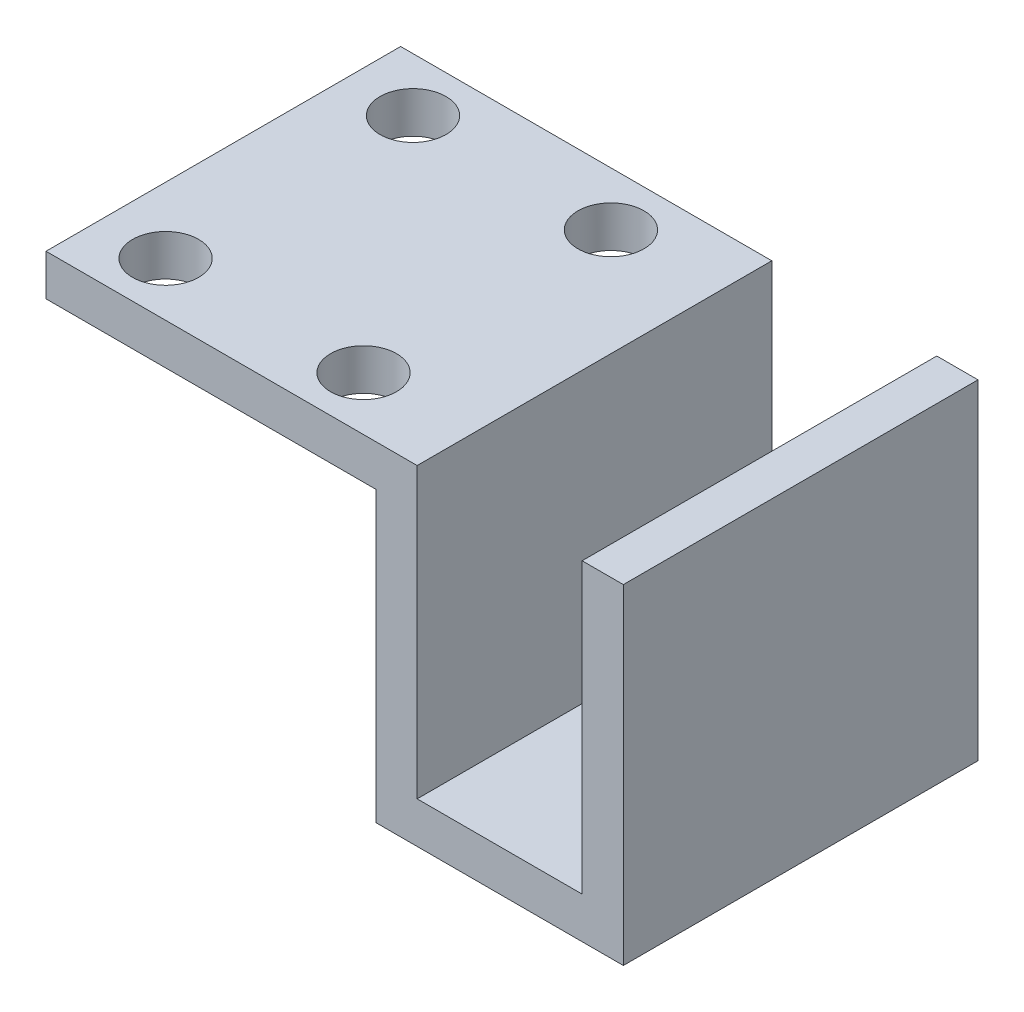
ISO-10303-21;
HEADER;
FILE_DESCRIPTION(('STEP AP214'),'2;1');
FILE_NAME('part.step','',(''),(''),'','','');
FILE_SCHEMA(('AUTOMOTIVE_DESIGN { 1 0 10303 214 1 1 1 1 }'));
ENDSEC;
DATA;
#1=APPLICATION_CONTEXT('core data for automotive mechanical design processes');
#2=APPLICATION_PROTOCOL_DEFINITION('international standard','automotive_design',2000,#1);
#3=PRODUCT_CONTEXT('',#1,'mechanical');
#4=PRODUCT('Part','Part','',(#3));
#5=PRODUCT_RELATED_PRODUCT_CATEGORY('part','',(#4));
#6=PRODUCT_DEFINITION_FORMATION('','',#4);
#7=PRODUCT_DEFINITION_CONTEXT('part definition',#1,'design');
#8=PRODUCT_DEFINITION('design','',#6,#7);
#9=PRODUCT_DEFINITION_SHAPE('','',#8);
#10=(LENGTH_UNIT() NAMED_UNIT(*) SI_UNIT(.MILLI.,.METRE.));
#11=(NAMED_UNIT(*) PLANE_ANGLE_UNIT() SI_UNIT($,.RADIAN.));
#12=(NAMED_UNIT(*) SI_UNIT($,.STERADIAN.) SOLID_ANGLE_UNIT());
#13=UNCERTAINTY_MEASURE_WITH_UNIT(LENGTH_MEASURE(1.E-05),#10,'distance_accuracy_value','');
#14=(GEOMETRIC_REPRESENTATION_CONTEXT(3) GLOBAL_UNCERTAINTY_ASSIGNED_CONTEXT((#13)) GLOBAL_UNIT_ASSIGNED_CONTEXT((#10,
#11,#12)) REPRESENTATION_CONTEXT('',''));
#15=CARTESIAN_POINT('',(0.,0.,0.));
#16=DIRECTION('',(0.,0.,1.));
#17=DIRECTION('',(1.,0.,0.));
#18=AXIS2_PLACEMENT_3D('',#15,#16,#17);
#19=CARTESIAN_POINT('',(0.,0.,43.));
#20=DIRECTION('',(1.,0.,0.));
#21=DIRECTION('',(0.,0.,-1.));
#22=AXIS2_PLACEMENT_3D('',#19,#20,#21);
#23=PLANE('',#22);
#24=DIRECTION('',(0.,-1.,0.));
#25=VECTOR('',#24,1.);
#26=CARTESIAN_POINT('',(0.,0.,0.));
#27=LINE('',#26,#25);
#28=CARTESIAN_POINT('',(0.,5.,0.));
#29=VERTEX_POINT('',#28);
#30=CARTESIAN_POINT('',(0.,0.,0.));
#31=VERTEX_POINT('',#30);
#32=EDGE_CURVE('E144',#29,#31,#27,.T.);
#33=ORIENTED_EDGE('',*,*,#32,.T.);
#34=DIRECTION('',(0.,0.,-1.));
#35=VECTOR('',#34,1.);
#36=CARTESIAN_POINT('',(0.,0.,43.));
#37=LINE('',#36,#35);
#38=CARTESIAN_POINT('',(0.,0.,43.));
#39=VERTEX_POINT('',#38);
#40=EDGE_CURVE('E11',#39,#31,#37,.T.);
#41=ORIENTED_EDGE('',*,*,#40,.F.);
#42=DIRECTION('',(0.,-1.,0.));
#43=VECTOR('',#42,1.);
#44=CARTESIAN_POINT('',(0.,0.,43.));
#45=LINE('',#44,#43);
#46=CARTESIAN_POINT('',(0.,5.,43.));
#47=VERTEX_POINT('',#46);
#48=EDGE_CURVE('E163',#47,#39,#45,.T.);
#49=ORIENTED_EDGE('',*,*,#48,.F.);
#50=DIRECTION('',(0.,0.,-1.));
#51=VECTOR('',#50,1.);
#52=CARTESIAN_POINT('',(0.,5.,43.));
#53=LINE('',#52,#51);
#54=EDGE_CURVE('E140',#47,#29,#53,.T.);
#55=ORIENTED_EDGE('',*,*,#54,.T.);
#56=EDGE_LOOP('',(#33,#41,#49,#55));
#57=FACE_BOUND('',#56,.T.);
#58=ADVANCED_FACE('F34',(#57),#23,.F.);
#59=CARTESIAN_POINT('',(0.,0.,43.));
#60=DIRECTION('',(0.,1.,0.));
#61=DIRECTION('',(0.,0.,1.));
#62=AXIS2_PLACEMENT_3D('',#59,#60,#61);
#63=PLANE('',#62);
#64=CARTESIAN_POINT('',(8.,0.,6.5));
#65=DIRECTION('',(0.,-1.,0.));
#66=DIRECTION('',(0.,0.,1.));
#67=AXIS2_PLACEMENT_3D('',#64,#65,#66);
#68=CIRCLE('',#67,4.);
#69=CARTESIAN_POINT('',(8.,0.,10.5));
#70=VERTEX_POINT('',#69);
#71=EDGE_CURVE('E199',#70,#70,#68,.T.);
#72=ORIENTED_EDGE('',*,*,#71,.F.);
#73=EDGE_LOOP('',(#72));
#74=FACE_BOUND('',#73,.T.);
#75=CARTESIAN_POINT('',(32.,0.,6.5));
#76=DIRECTION('',(0.,-1.,0.));
#77=DIRECTION('',(0.,0.,1.));
#78=AXIS2_PLACEMENT_3D('',#75,#76,#77);
#79=CIRCLE('',#78,4.00000000000001);
#80=CARTESIAN_POINT('',(32.,0.,10.5));
#81=VERTEX_POINT('',#80);
#82=EDGE_CURVE('E189',#81,#81,#79,.T.);
#83=ORIENTED_EDGE('',*,*,#82,.F.);
#84=EDGE_LOOP('',(#83));
#85=FACE_BOUND('',#84,.T.);
#86=CARTESIAN_POINT('',(32.,0.,36.5));
#87=DIRECTION('',(0.,-1.,0.));
#88=DIRECTION('',(0.,0.,-1.));
#89=AXIS2_PLACEMENT_3D('',#86,#87,#88);
#90=CIRCLE('',#89,4.00000000000001);
#91=CARTESIAN_POINT('',(32.,0.,32.5));
#92=VERTEX_POINT('',#91);
#93=EDGE_CURVE('E186',#92,#92,#90,.T.);
#94=ORIENTED_EDGE('',*,*,#93,.F.);
#95=EDGE_LOOP('',(#94));
#96=FACE_BOUND('',#95,.T.);
#97=CARTESIAN_POINT('',(8.,0.,36.5));
#98=DIRECTION('',(0.,-1.,0.));
#99=DIRECTION('',(0.,0.,-1.));
#100=AXIS2_PLACEMENT_3D('',#97,#98,#99);
#101=CIRCLE('',#100,4.);
#102=CARTESIAN_POINT('',(8.,0.,32.5));
#103=VERTEX_POINT('',#102);
#104=EDGE_CURVE('E183',#103,#103,#101,.T.);
#105=ORIENTED_EDGE('',*,*,#104,.F.);
#106=EDGE_LOOP('',(#105));
#107=FACE_BOUND('',#106,.T.);
#108=DIRECTION('',(1.,0.,0.));
#109=VECTOR('',#108,1.);
#110=CARTESIAN_POINT('',(0.,0.,0.));
#111=LINE('',#110,#109);
#112=CARTESIAN_POINT('',(40.,0.,0.));
#113=VERTEX_POINT('',#112);
#114=EDGE_CURVE('E147',#31,#113,#111,.T.);
#115=ORIENTED_EDGE('',*,*,#114,.T.);
#116=DIRECTION('',(0.,0.,-1.));
#117=VECTOR('',#116,1.);
#118=CARTESIAN_POINT('',(40.,0.,43.));
#119=LINE('',#118,#117);
#120=CARTESIAN_POINT('',(40.,0.,43.));
#121=VERTEX_POINT('',#120);
#122=EDGE_CURVE('E43',#121,#113,#119,.T.);
#123=ORIENTED_EDGE('',*,*,#122,.F.);
#124=DIRECTION('',(1.,0.,0.));
#125=VECTOR('',#124,1.);
#126=CARTESIAN_POINT('',(0.,0.,43.));
#127=LINE('',#126,#125);
#128=EDGE_CURVE('E101',#39,#121,#127,.T.);
#129=ORIENTED_EDGE('',*,*,#128,.F.);
#130=ORIENTED_EDGE('',*,*,#40,.T.);
#131=EDGE_LOOP('',(#115,#123,#129,#130));
#132=FACE_BOUND('',#131,.T.);
#133=ADVANCED_FACE('F242',(#74,#85,#96,#107,#132),#63,.F.);
#134=CARTESIAN_POINT('',(40.,0.,43.));
#135=DIRECTION('',(1.,0.,0.));
#136=DIRECTION('',(0.,0.,-1.));
#137=AXIS2_PLACEMENT_3D('',#134,#135,#136);
#138=PLANE('',#137);
#139=DIRECTION('',(0.,-1.,0.));
#140=VECTOR('',#139,1.);
#141=CARTESIAN_POINT('',(40.,0.,0.));
#142=LINE('',#141,#140);
#143=CARTESIAN_POINT('',(40.,-35.,0.));
#144=VERTEX_POINT('',#143);
#145=EDGE_CURVE('E150',#113,#144,#142,.T.);
#146=ORIENTED_EDGE('',*,*,#145,.T.);
#147=DIRECTION('',(0.,0.,-1.));
#148=VECTOR('',#147,1.);
#149=CARTESIAN_POINT('',(40.,-35.,43.));
#150=LINE('',#149,#148);
#151=CARTESIAN_POINT('',(40.,-35.,43.));
#152=VERTEX_POINT('',#151);
#153=EDGE_CURVE('E176',#152,#144,#150,.T.);
#154=ORIENTED_EDGE('',*,*,#153,.F.);
#155=DIRECTION('',(0.,-1.,0.));
#156=VECTOR('',#155,1.);
#157=CARTESIAN_POINT('',(40.,0.,43.));
#158=LINE('',#157,#156);
#159=EDGE_CURVE('E206',#121,#152,#158,.T.);
#160=ORIENTED_EDGE('',*,*,#159,.F.);
#161=ORIENTED_EDGE('',*,*,#122,.T.);
#162=EDGE_LOOP('',(#146,#154,#160,#161));
#163=FACE_BOUND('',#162,.T.);
#164=ADVANCED_FACE('F246',(#163),#138,.F.);
#165=CARTESIAN_POINT('',(40.,-35.,43.));
#166=DIRECTION('',(0.,1.,0.));
#167=DIRECTION('',(0.,0.,1.));
#168=AXIS2_PLACEMENT_3D('',#165,#166,#167);
#169=PLANE('',#168);
#170=DIRECTION('',(1.,0.,0.));
#171=VECTOR('',#170,1.);
#172=CARTESIAN_POINT('',(40.,-35.,0.));
#173=LINE('',#172,#171);
#174=CARTESIAN_POINT('',(70.,-35.,0.));
#175=VERTEX_POINT('',#174);
#176=EDGE_CURVE('E152',#144,#175,#173,.T.);
#177=ORIENTED_EDGE('',*,*,#176,.T.);
#178=DIRECTION('',(0.,0.,-1.));
#179=VECTOR('',#178,1.);
#180=CARTESIAN_POINT('',(70.,-35.,43.));
#181=LINE('',#180,#179);
#182=CARTESIAN_POINT('',(70.,-35.,43.));
#183=VERTEX_POINT('',#182);
#184=EDGE_CURVE('E173',#183,#175,#181,.T.);
#185=ORIENTED_EDGE('',*,*,#184,.F.);
#186=DIRECTION('',(1.,0.,0.));
#187=VECTOR('',#186,1.);
#188=CARTESIAN_POINT('',(40.,-35.,43.));
#189=LINE('',#188,#187);
#190=EDGE_CURVE('E208',#152,#183,#189,.T.);
#191=ORIENTED_EDGE('',*,*,#190,.F.);
#192=ORIENTED_EDGE('',*,*,#153,.T.);
#193=EDGE_LOOP('',(#177,#185,#191,#192));
#194=FACE_BOUND('',#193,.T.);
#195=ADVANCED_FACE('F251',(#194),#169,.F.);
#196=CARTESIAN_POINT('',(70.,5.,43.));
#197=DIRECTION('',(-1.,0.,0.));
#198=DIRECTION('',(0.,0.,1.));
#199=AXIS2_PLACEMENT_3D('',#196,#197,#198);
#200=PLANE('',#199);
#201=DIRECTION('',(0.,1.,0.));
#202=VECTOR('',#201,1.);
#203=CARTESIAN_POINT('',(70.,5.,0.));
#204=LINE('',#203,#202);
#205=CARTESIAN_POINT('',(70.,5.,0.));
#206=VERTEX_POINT('',#205);
#207=EDGE_CURVE('E154',#175,#206,#204,.T.);
#208=ORIENTED_EDGE('',*,*,#207,.T.);
#209=DIRECTION('',(0.,0.,-1.));
#210=VECTOR('',#209,1.);
#211=CARTESIAN_POINT('',(70.,5.,43.));
#212=LINE('',#211,#210);
#213=CARTESIAN_POINT('',(70.,5.,43.));
#214=VERTEX_POINT('',#213);
#215=EDGE_CURVE('E170',#214,#206,#212,.T.);
#216=ORIENTED_EDGE('',*,*,#215,.F.);
#217=DIRECTION('',(0.,1.,0.));
#218=VECTOR('',#217,1.);
#219=CARTESIAN_POINT('',(70.,5.,43.));
#220=LINE('',#219,#218);
#221=EDGE_CURVE('E210',#183,#214,#220,.T.);
#222=ORIENTED_EDGE('',*,*,#221,.F.);
#223=ORIENTED_EDGE('',*,*,#184,.T.);
#224=EDGE_LOOP('',(#208,#216,#222,#223));
#225=FACE_BOUND('',#224,.T.);
#226=ADVANCED_FACE('F259',(#225),#200,.F.);
#227=CARTESIAN_POINT('',(65.,5.00000000000001,43.));
#228=DIRECTION('',(0.,-1.,0.));
#229=DIRECTION('',(1.,0.,0.));
#230=AXIS2_PLACEMENT_3D('',#227,#228,#229);
#231=PLANE('',#230);
#232=DIRECTION('',(-1.,0.,0.));
#233=VECTOR('',#232,1.);
#234=CARTESIAN_POINT('',(65.,5.00000000000001,0.));
#235=LINE('',#234,#233);
#236=CARTESIAN_POINT('',(65.,5.00000000000001,0.));
#237=VERTEX_POINT('',#236);
#238=EDGE_CURVE('E156',#206,#237,#235,.T.);
#239=ORIENTED_EDGE('',*,*,#238,.T.);
#240=DIRECTION('',(0.,0.,-1.));
#241=VECTOR('',#240,1.);
#242=CARTESIAN_POINT('',(65.,5.00000000000001,43.));
#243=LINE('',#242,#241);
#244=CARTESIAN_POINT('',(65.,5.00000000000001,43.));
#245=VERTEX_POINT('',#244);
#246=EDGE_CURVE('E167',#245,#237,#243,.T.);
#247=ORIENTED_EDGE('',*,*,#246,.F.);
#248=DIRECTION('',(-1.,0.,0.));
#249=VECTOR('',#248,1.);
#250=CARTESIAN_POINT('',(65.,5.00000000000001,43.));
#251=LINE('',#250,#249);
#252=EDGE_CURVE('E212',#214,#245,#251,.T.);
#253=ORIENTED_EDGE('',*,*,#252,.F.);
#254=ORIENTED_EDGE('',*,*,#215,.T.);
#255=EDGE_LOOP('',(#239,#247,#253,#254));
#256=FACE_BOUND('',#255,.T.);
#257=ADVANCED_FACE('F218',(#256),#231,.F.);
#258=CARTESIAN_POINT('',(65.,-30.,43.));
#259=DIRECTION('',(1.,0.,0.));
#260=DIRECTION('',(0.,0.,-1.));
#261=AXIS2_PLACEMENT_3D('',#258,#259,#260);
#262=PLANE('',#261);
#263=DIRECTION('',(0.,-1.,0.));
#264=VECTOR('',#263,1.);
#265=CARTESIAN_POINT('',(65.,-30.,0.));
#266=LINE('',#265,#264);
#267=CARTESIAN_POINT('',(65.,-30.,0.));
#268=VERTEX_POINT('',#267);
#269=EDGE_CURVE('E158',#237,#268,#266,.T.);
#270=ORIENTED_EDGE('',*,*,#269,.T.);
#271=DIRECTION('',(0.,0.,-1.));
#272=VECTOR('',#271,1.);
#273=CARTESIAN_POINT('',(65.,-30.,43.));
#274=LINE('',#273,#272);
#275=CARTESIAN_POINT('',(65.,-30.,43.));
#276=VERTEX_POINT('',#275);
#277=EDGE_CURVE('E135',#276,#268,#274,.T.);
#278=ORIENTED_EDGE('',*,*,#277,.F.);
#279=DIRECTION('',(0.,-1.,0.));
#280=VECTOR('',#279,1.);
#281=CARTESIAN_POINT('',(65.,-30.,43.));
#282=LINE('',#281,#280);
#283=EDGE_CURVE('E126',#245,#276,#282,.T.);
#284=ORIENTED_EDGE('',*,*,#283,.F.);
#285=ORIENTED_EDGE('',*,*,#246,.T.);
#286=EDGE_LOOP('',(#270,#278,#284,#285));
#287=FACE_BOUND('',#286,.T.);
#288=ADVANCED_FACE('F222',(#287),#262,.F.);
#289=CARTESIAN_POINT('',(45.,-30.,43.));
#290=DIRECTION('',(0.,-1.,0.));
#291=DIRECTION('',(1.,0.,0.));
#292=AXIS2_PLACEMENT_3D('',#289,#290,#291);
#293=PLANE('',#292);
#294=DIRECTION('',(-1.,0.,0.));
#295=VECTOR('',#294,1.);
#296=CARTESIAN_POINT('',(45.,-30.,0.));
#297=LINE('',#296,#295);
#298=CARTESIAN_POINT('',(45.,-30.,0.));
#299=VERTEX_POINT('',#298);
#300=EDGE_CURVE('E134',#268,#299,#297,.T.);
#301=ORIENTED_EDGE('',*,*,#300,.T.);
#302=DIRECTION('',(0.,0.,-1.));
#303=VECTOR('',#302,1.);
#304=CARTESIAN_POINT('',(45.,-30.,43.));
#305=LINE('',#304,#303);
#306=CARTESIAN_POINT('',(45.,-30.,43.));
#307=VERTEX_POINT('',#306);
#308=EDGE_CURVE('E131',#307,#299,#305,.T.);
#309=ORIENTED_EDGE('',*,*,#308,.F.);
#310=DIRECTION('',(-1.,0.,0.));
#311=VECTOR('',#310,1.);
#312=CARTESIAN_POINT('',(45.,-30.,43.));
#313=LINE('',#312,#311);
#314=EDGE_CURVE('E120',#276,#307,#313,.T.);
#315=ORIENTED_EDGE('',*,*,#314,.F.);
#316=ORIENTED_EDGE('',*,*,#277,.T.);
#317=EDGE_LOOP('',(#301,#309,#315,#316));
#318=FACE_BOUND('',#317,.T.);
#319=ADVANCED_FACE('F132',(#318),#293,.F.);
#320=CARTESIAN_POINT('',(45.,5.,43.));
#321=DIRECTION('',(-1.,0.,0.));
#322=DIRECTION('',(0.,0.,1.));
#323=AXIS2_PLACEMENT_3D('',#320,#321,#322);
#324=PLANE('',#323);
#325=DIRECTION('',(0.,1.,0.));
#326=VECTOR('',#325,1.);
#327=CARTESIAN_POINT('',(45.,5.,0.));
#328=LINE('',#327,#326);
#329=CARTESIAN_POINT('',(45.,5.,0.));
#330=VERTEX_POINT('',#329);
#331=EDGE_CURVE('E87',#299,#330,#328,.T.);
#332=ORIENTED_EDGE('',*,*,#331,.T.);
#333=DIRECTION('',(0.,0.,-1.));
#334=VECTOR('',#333,1.);
#335=CARTESIAN_POINT('',(45.,5.,43.));
#336=LINE('',#335,#334);
#337=CARTESIAN_POINT('',(45.,5.,43.));
#338=VERTEX_POINT('',#337);
#339=EDGE_CURVE('E136',#338,#330,#336,.T.);
#340=ORIENTED_EDGE('',*,*,#339,.F.);
#341=DIRECTION('',(0.,1.,0.));
#342=VECTOR('',#341,1.);
#343=CARTESIAN_POINT('',(45.,5.,43.));
#344=LINE('',#343,#342);
#345=EDGE_CURVE('E124',#307,#338,#344,.T.);
#346=ORIENTED_EDGE('',*,*,#345,.F.);
#347=ORIENTED_EDGE('',*,*,#308,.T.);
#348=EDGE_LOOP('',(#332,#340,#346,#347));
#349=FACE_BOUND('',#348,.T.);
#350=ADVANCED_FACE('F138',(#349),#324,.F.);
#351=CARTESIAN_POINT('',(0.,5.,43.));
#352=DIRECTION('',(0.,-1.,0.));
#353=DIRECTION('',(0.,0.,-1.));
#354=AXIS2_PLACEMENT_3D('',#351,#352,#353);
#355=PLANE('',#354);
#356=CARTESIAN_POINT('',(8.,5.,6.5));
#357=DIRECTION('',(0.,-1.,0.));
#358=DIRECTION('',(0.,0.,-1.));
#359=AXIS2_PLACEMENT_3D('',#356,#357,#358);
#360=CIRCLE('',#359,4.);
#361=CARTESIAN_POINT('',(8.,5.,2.5));
#362=VERTEX_POINT('',#361);
#363=EDGE_CURVE('E37',#362,#362,#360,.T.);
#364=ORIENTED_EDGE('',*,*,#363,.T.);
#365=EDGE_LOOP('',(#364));
#366=FACE_BOUND('',#365,.T.);
#367=CARTESIAN_POINT('',(32.,5.,6.5));
#368=DIRECTION('',(0.,-1.,0.));
#369=DIRECTION('',(0.,0.,-1.));
#370=AXIS2_PLACEMENT_3D('',#367,#368,#369);
#371=CIRCLE('',#370,4.00000000000001);
#372=CARTESIAN_POINT('',(32.,5.,2.49999999999999));
#373=VERTEX_POINT('',#372);
#374=EDGE_CURVE('E187',#373,#373,#371,.T.);
#375=ORIENTED_EDGE('',*,*,#374,.T.);
#376=EDGE_LOOP('',(#375));
#377=FACE_BOUND('',#376,.T.);
#378=CARTESIAN_POINT('',(32.,5.,36.5));
#379=DIRECTION('',(0.,-1.,0.));
#380=DIRECTION('',(0.,0.,-1.));
#381=AXIS2_PLACEMENT_3D('',#378,#379,#380);
#382=CIRCLE('',#381,4.00000000000001);
#383=CARTESIAN_POINT('',(32.,5.,32.5));
#384=VERTEX_POINT('',#383);
#385=EDGE_CURVE('E184',#384,#384,#382,.T.);
#386=ORIENTED_EDGE('',*,*,#385,.T.);
#387=EDGE_LOOP('',(#386));
#388=FACE_BOUND('',#387,.T.);
#389=CARTESIAN_POINT('',(8.,5.,36.5));
#390=DIRECTION('',(0.,-1.,0.));
#391=DIRECTION('',(0.,0.,-1.));
#392=AXIS2_PLACEMENT_3D('',#389,#390,#391);
#393=CIRCLE('',#392,4.);
#394=CARTESIAN_POINT('',(8.,5.,32.5));
#395=VERTEX_POINT('',#394);
#396=EDGE_CURVE('E148',#395,#395,#393,.T.);
#397=ORIENTED_EDGE('',*,*,#396,.T.);
#398=EDGE_LOOP('',(#397));
#399=FACE_BOUND('',#398,.T.);
#400=DIRECTION('',(-1.,0.,0.));
#401=VECTOR('',#400,1.);
#402=CARTESIAN_POINT('',(0.,5.,0.));
#403=LINE('',#402,#401);
#404=EDGE_CURVE('E93',#330,#29,#403,.T.);
#405=ORIENTED_EDGE('',*,*,#404,.T.);
#406=ORIENTED_EDGE('',*,*,#54,.F.);
#407=DIRECTION('',(-1.,0.,0.));
#408=VECTOR('',#407,1.);
#409=CARTESIAN_POINT('',(0.,5.,43.));
#410=LINE('',#409,#408);
#411=EDGE_CURVE('E52',#338,#47,#410,.T.);
#412=ORIENTED_EDGE('',*,*,#411,.F.);
#413=ORIENTED_EDGE('',*,*,#339,.T.);
#414=EDGE_LOOP('',(#405,#406,#412,#413));
#415=FACE_BOUND('',#414,.T.);
#416=ADVANCED_FACE('F230',(#366,#377,#388,#399,#415),#355,.F.);
#417=CARTESIAN_POINT('',(0.,0.,43.));
#418=DIRECTION('',(0.,0.,-1.));
#419=DIRECTION('',(-1.,0.,0.));
#420=AXIS2_PLACEMENT_3D('',#417,#418,#419);
#421=PLANE('',#420);
#422=ORIENTED_EDGE('',*,*,#48,.T.);
#423=ORIENTED_EDGE('',*,*,#128,.T.);
#424=ORIENTED_EDGE('',*,*,#159,.T.);
#425=ORIENTED_EDGE('',*,*,#190,.T.);
#426=ORIENTED_EDGE('',*,*,#221,.T.);
#427=ORIENTED_EDGE('',*,*,#252,.T.);
#428=ORIENTED_EDGE('',*,*,#283,.T.);
#429=ORIENTED_EDGE('',*,*,#314,.T.);
#430=ORIENTED_EDGE('',*,*,#345,.T.);
#431=ORIENTED_EDGE('',*,*,#411,.T.);
#432=EDGE_LOOP('',(#422,#423,#424,#425,#426,#427,#428,#429,#430,#431));
#433=FACE_BOUND('',#432,.T.);
#434=ADVANCED_FACE('F122',(#433),#421,.F.);
#435=CARTESIAN_POINT('',(0.,0.,0.));
#436=DIRECTION('',(0.,0.,-1.));
#437=DIRECTION('',(-1.,0.,0.));
#438=AXIS2_PLACEMENT_3D('',#435,#436,#437);
#439=PLANE('',#438);
#440=ORIENTED_EDGE('',*,*,#32,.F.);
#441=ORIENTED_EDGE('',*,*,#404,.F.);
#442=ORIENTED_EDGE('',*,*,#331,.F.);
#443=ORIENTED_EDGE('',*,*,#300,.F.);
#444=ORIENTED_EDGE('',*,*,#269,.F.);
#445=ORIENTED_EDGE('',*,*,#238,.F.);
#446=ORIENTED_EDGE('',*,*,#207,.F.);
#447=ORIENTED_EDGE('',*,*,#176,.F.);
#448=ORIENTED_EDGE('',*,*,#145,.F.);
#449=ORIENTED_EDGE('',*,*,#114,.F.);
#450=EDGE_LOOP('',(#440,#441,#442,#443,#444,#445,#446,#447,#448,#449));
#451=FACE_BOUND('',#450,.T.);
#452=ADVANCED_FACE('F225',(#451),#439,.T.);
#453=CARTESIAN_POINT('',(8.,10.,36.5));
#454=DIRECTION('',(0.,-1.,0.));
#455=DIRECTION('',(0.,0.,-1.));
#456=AXIS2_PLACEMENT_3D('',#453,#454,#455);
#457=CYLINDRICAL_SURFACE('',#456,4.);
#458=ORIENTED_EDGE('',*,*,#104,.T.);
#459=EDGE_LOOP('',(#458));
#460=FACE_BOUND('',#459,.T.);
#461=ORIENTED_EDGE('',*,*,#396,.F.);
#462=EDGE_LOOP('',(#461));
#463=FACE_BOUND('',#462,.T.);
#464=ADVANCED_FACE('F292',(#460,#463),#457,.F.);
#465=CARTESIAN_POINT('',(32.,10.,36.5));
#466=DIRECTION('',(0.,-1.,0.));
#467=DIRECTION('',(0.,0.,-1.));
#468=AXIS2_PLACEMENT_3D('',#465,#466,#467);
#469=CYLINDRICAL_SURFACE('',#468,4.00000000000001);
#470=ORIENTED_EDGE('',*,*,#93,.T.);
#471=EDGE_LOOP('',(#470));
#472=FACE_BOUND('',#471,.T.);
#473=ORIENTED_EDGE('',*,*,#385,.F.);
#474=EDGE_LOOP('',(#473));
#475=FACE_BOUND('',#474,.T.);
#476=ADVANCED_FACE('F310',(#472,#475),#469,.F.);
#477=CARTESIAN_POINT('',(32.,10.,6.5));
#478=DIRECTION('',(0.,-1.,0.));
#479=DIRECTION('',(0.,0.,-1.));
#480=AXIS2_PLACEMENT_3D('',#477,#478,#479);
#481=CYLINDRICAL_SURFACE('',#480,4.00000000000001);
#482=ORIENTED_EDGE('',*,*,#82,.T.);
#483=EDGE_LOOP('',(#482));
#484=FACE_BOUND('',#483,.T.);
#485=ORIENTED_EDGE('',*,*,#374,.F.);
#486=EDGE_LOOP('',(#485));
#487=FACE_BOUND('',#486,.T.);
#488=ADVANCED_FACE('F320',(#484,#487),#481,.F.);
#489=CARTESIAN_POINT('',(8.,10.,6.5));
#490=DIRECTION('',(0.,-1.,0.));
#491=DIRECTION('',(0.,0.,-1.));
#492=AXIS2_PLACEMENT_3D('',#489,#490,#491);
#493=CYLINDRICAL_SURFACE('',#492,4.);
#494=ORIENTED_EDGE('',*,*,#71,.T.);
#495=EDGE_LOOP('',(#494));
#496=FACE_BOUND('',#495,.T.);
#497=ORIENTED_EDGE('',*,*,#363,.F.);
#498=EDGE_LOOP('',(#497));
#499=FACE_BOUND('',#498,.T.);
#500=ADVANCED_FACE('F330',(#496,#499),#493,.F.);
#501=CLOSED_SHELL('',(#58,#133,#164,#195,#226,#257,#288,#319,#350,#416,#434,#452,#464,#476,#488,#500));
#502=MANIFOLD_SOLID_BREP('B2',#501);
#503=ADVANCED_BREP_SHAPE_REPRESENTATION('',(#18,#502),#14);
#504=SHAPE_DEFINITION_REPRESENTATION(#9,#503);
ENDSEC;
END-ISO-10303-21;
